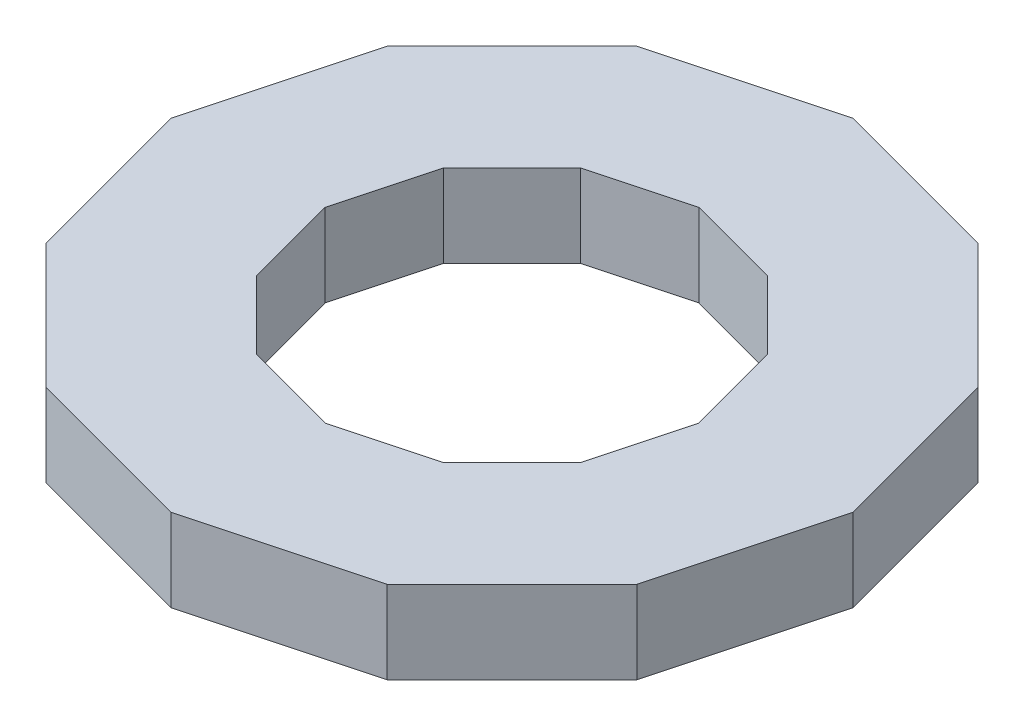
ISO-10303-21;
HEADER;
FILE_DESCRIPTION(('STEP AP214'),'2;1');
FILE_NAME('part.step','',(''),(''),'','','');
FILE_SCHEMA(('AUTOMOTIVE_DESIGN { 1 0 10303 214 1 1 1 1 }'));
ENDSEC;
DATA;
#1=APPLICATION_CONTEXT('core data for automotive mechanical design processes');
#2=APPLICATION_PROTOCOL_DEFINITION('international standard','automotive_design',2000,#1);
#3=PRODUCT_CONTEXT('',#1,'mechanical');
#4=PRODUCT('Part','Part','',(#3));
#5=PRODUCT_RELATED_PRODUCT_CATEGORY('part','',(#4));
#6=PRODUCT_DEFINITION_FORMATION('','',#4);
#7=PRODUCT_DEFINITION_CONTEXT('part definition',#1,'design');
#8=PRODUCT_DEFINITION('design','',#6,#7);
#9=PRODUCT_DEFINITION_SHAPE('','',#8);
#10=(LENGTH_UNIT() NAMED_UNIT(*) SI_UNIT(.MILLI.,.METRE.));
#11=(NAMED_UNIT(*) PLANE_ANGLE_UNIT() SI_UNIT($,.RADIAN.));
#12=(NAMED_UNIT(*) SI_UNIT($,.STERADIAN.) SOLID_ANGLE_UNIT());
#13=UNCERTAINTY_MEASURE_WITH_UNIT(LENGTH_MEASURE(1.E-05),#10,'distance_accuracy_value','');
#14=(GEOMETRIC_REPRESENTATION_CONTEXT(3) GLOBAL_UNCERTAINTY_ASSIGNED_CONTEXT((#13)) GLOBAL_UNIT_ASSIGNED_CONTEXT((#10,
#11,#12)) REPRESENTATION_CONTEXT('',''));
#15=CARTESIAN_POINT('',(0.,0.,0.));
#16=DIRECTION('',(0.,0.,1.));
#17=DIRECTION('',(1.,0.,0.));
#18=AXIS2_PLACEMENT_3D('',#15,#16,#17);
#19=CARTESIAN_POINT('',(0.,19.05,0.));
#20=DIRECTION('',(0.,1.,0.));
#21=DIRECTION('',(0.,0.,1.));
#22=AXIS2_PLACEMENT_3D('',#19,#20,#21);
#23=PLANE('',#22);
#24=DIRECTION('',(0.258819045102521,0.,-0.965925826289068));
#25=VECTOR('',#24,1.);
#26=CARTESIAN_POINT('',(67.9920451678091,19.05,39.2552255803878));
#27=LINE('',#26,#25);
#28=CARTESIAN_POINT('',(67.9920451678091,19.05,39.2552255803878));
#29=VERTEX_POINT('',#28);
#30=CARTESIAN_POINT('',(78.5104511607755,19.05,0.));
#31=VERTEX_POINT('',#30);
#32=EDGE_CURVE('E299',#29,#31,#27,.T.);
#33=ORIENTED_EDGE('',*,*,#32,.T.);
#34=DIRECTION('',(-0.25881904510252,0.,-0.965925826289069));
#35=VECTOR('',#34,1.);
#36=CARTESIAN_POINT('',(78.5104511607755,19.05,0.));
#37=LINE('',#36,#35);
#38=CARTESIAN_POINT('',(67.9920451678091,19.05,-39.2552255803878));
#39=VERTEX_POINT('',#38);
#40=EDGE_CURVE('E303',#31,#39,#37,.T.);
#41=ORIENTED_EDGE('',*,*,#40,.T.);
#42=DIRECTION('',(-0.707106781186548,0.,-0.707106781186547));
#43=VECTOR('',#42,1.);
#44=CARTESIAN_POINT('',(67.9920451678091,19.05,-39.2552255803878));
#45=LINE('',#44,#43);
#46=CARTESIAN_POINT('',(39.2552255803878,19.05,-67.9920451678091));
#47=VERTEX_POINT('',#46);
#48=EDGE_CURVE('E307',#39,#47,#45,.T.);
#49=ORIENTED_EDGE('',*,*,#48,.T.);
#50=DIRECTION('',(-0.965925826289068,0.,-0.258819045102521));
#51=VECTOR('',#50,1.);
#52=CARTESIAN_POINT('',(39.2552255803878,19.05,-67.9920451678091));
#53=LINE('',#52,#51);
#54=CARTESIAN_POINT('',(0.,19.05,-78.5104511607755));
#55=VERTEX_POINT('',#54);
#56=EDGE_CURVE('E309',#47,#55,#53,.T.);
#57=ORIENTED_EDGE('',*,*,#56,.T.);
#58=DIRECTION('',(-0.965925826289068,0.,0.258819045102521));
#59=VECTOR('',#58,1.);
#60=CARTESIAN_POINT('',(0.,19.05,-78.5104511607755));
#61=LINE('',#60,#59);
#62=CARTESIAN_POINT('',(-39.2552255803877,19.05,-67.9920451678091));
#63=VERTEX_POINT('',#62);
#64=EDGE_CURVE('E312',#55,#63,#61,.T.);
#65=ORIENTED_EDGE('',*,*,#64,.T.);
#66=DIRECTION('',(-0.707106781186548,0.,0.707106781186548));
#67=VECTOR('',#66,1.);
#68=CARTESIAN_POINT('',(-39.2552255803877,19.05,-67.9920451678091));
#69=LINE('',#68,#67);
#70=CARTESIAN_POINT('',(-67.9920451678091,19.05,-39.2552255803877));
#71=VERTEX_POINT('',#70);
#72=EDGE_CURVE('E315',#63,#71,#69,.T.);
#73=ORIENTED_EDGE('',*,*,#72,.T.);
#74=DIRECTION('',(-0.258819045102521,0.,0.965925826289068));
#75=VECTOR('',#74,1.);
#76=CARTESIAN_POINT('',(-67.9920451678091,19.05,-39.2552255803877));
#77=LINE('',#76,#75);
#78=CARTESIAN_POINT('',(-78.5104511607755,19.05,0.));
#79=VERTEX_POINT('',#78);
#80=EDGE_CURVE('E317',#71,#79,#77,.T.);
#81=ORIENTED_EDGE('',*,*,#80,.T.);
#82=DIRECTION('',(0.25881904510252,0.,0.965925826289068));
#83=VECTOR('',#82,1.);
#84=CARTESIAN_POINT('',(-78.5104511607755,19.05,0.));
#85=LINE('',#84,#83);
#86=CARTESIAN_POINT('',(-67.9920451678091,19.05,39.2552255803878));
#87=VERTEX_POINT('',#86);
#88=EDGE_CURVE('E320',#79,#87,#85,.T.);
#89=ORIENTED_EDGE('',*,*,#88,.T.);
#90=DIRECTION('',(0.707106781186548,0.,0.707106781186547));
#91=VECTOR('',#90,1.);
#92=CARTESIAN_POINT('',(-67.9920451678091,19.05,39.2552255803878));
#93=LINE('',#92,#91);
#94=CARTESIAN_POINT('',(-39.2552255803878,19.05,67.9920451678091));
#95=VERTEX_POINT('',#94);
#96=EDGE_CURVE('E322',#87,#95,#93,.T.);
#97=ORIENTED_EDGE('',*,*,#96,.T.);
#98=DIRECTION('',(0.965925826289068,0.,0.258819045102521));
#99=VECTOR('',#98,1.);
#100=CARTESIAN_POINT('',(-39.2552255803878,19.05,67.9920451678091));
#101=LINE('',#100,#99);
#102=CARTESIAN_POINT('',(0.,19.05,78.5104511607755));
#103=VERTEX_POINT('',#102);
#104=EDGE_CURVE('E324',#95,#103,#101,.T.);
#105=ORIENTED_EDGE('',*,*,#104,.T.);
#106=DIRECTION('',(0.965925826289068,0.,-0.25881904510252));
#107=VECTOR('',#106,1.);
#108=CARTESIAN_POINT('',(0.,19.05,78.5104511607755));
#109=LINE('',#108,#107);
#110=CARTESIAN_POINT('',(39.2552255803877,19.05,67.9920451678091));
#111=VERTEX_POINT('',#110);
#112=EDGE_CURVE('E326',#103,#111,#109,.T.);
#113=ORIENTED_EDGE('',*,*,#112,.T.);
#114=DIRECTION('',(0.707106781186547,0.,-0.707106781186548));
#115=VECTOR('',#114,1.);
#116=CARTESIAN_POINT('',(39.2552255803877,19.05,67.9920451678091));
#117=LINE('',#116,#115);
#118=EDGE_CURVE('E328',#111,#29,#117,.T.);
#119=ORIENTED_EDGE('',*,*,#118,.T.);
#120=EDGE_LOOP('',(#33,#41,#49,#57,#65,#73,#81,#89,#97,#105,#113,#119));
#121=FACE_BOUND('',#120,.T.);
#122=DIRECTION('',(-0.258819045102521,0.,-0.965925826289068));
#123=VECTOR('',#122,1.);
#124=CARTESIAN_POINT('',(43.0108309345138,19.05,0.));
#125=LINE('',#124,#123);
#126=CARTESIAN_POINT('',(43.0108309345138,19.05,0.));
#127=VERTEX_POINT('',#126);
#128=CARTESIAN_POINT('',(37.2484722271665,19.05,-21.5054154672569));
#129=VERTEX_POINT('',#128);
#130=EDGE_CURVE('E206',#127,#129,#125,.T.);
#131=ORIENTED_EDGE('',*,*,#130,.F.);
#132=DIRECTION('',(0.258819045102521,0.,-0.965925826289068));
#133=VECTOR('',#132,1.);
#134=CARTESIAN_POINT('',(37.2484722271665,19.05,21.5054154672569));
#135=LINE('',#134,#133);
#136=CARTESIAN_POINT('',(37.2484722271665,19.05,21.5054154672569));
#137=VERTEX_POINT('',#136);
#138=EDGE_CURVE('E197',#137,#127,#135,.T.);
#139=ORIENTED_EDGE('',*,*,#138,.F.);
#140=DIRECTION('',(0.707106781186547,0.,-0.707106781186547));
#141=VECTOR('',#140,1.);
#142=CARTESIAN_POINT('',(21.5054154672569,19.05,37.2484722271665));
#143=LINE('',#142,#141);
#144=CARTESIAN_POINT('',(21.5054154672569,19.05,37.2484722271665));
#145=VERTEX_POINT('',#144);
#146=EDGE_CURVE('E244',#145,#137,#143,.T.);
#147=ORIENTED_EDGE('',*,*,#146,.F.);
#148=DIRECTION('',(0.965925826289068,0.,-0.258819045102521));
#149=VECTOR('',#148,1.);
#150=CARTESIAN_POINT('',(0.,19.05,43.0108309345138));
#151=LINE('',#150,#149);
#152=CARTESIAN_POINT('',(0.,19.05,43.0108309345138));
#153=VERTEX_POINT('',#152);
#154=EDGE_CURVE('E242',#153,#145,#151,.T.);
#155=ORIENTED_EDGE('',*,*,#154,.F.);
#156=DIRECTION('',(0.965925826289068,0.,0.258819045102521));
#157=VECTOR('',#156,1.);
#158=CARTESIAN_POINT('',(-21.5054154672569,19.05,37.2484722271665));
#159=LINE('',#158,#157);
#160=CARTESIAN_POINT('',(-21.5054154672569,19.05,37.2484722271665));
#161=VERTEX_POINT('',#160);
#162=EDGE_CURVE('E240',#161,#153,#159,.T.);
#163=ORIENTED_EDGE('',*,*,#162,.F.);
#164=DIRECTION('',(0.707106781186547,0.,0.707106781186547));
#165=VECTOR('',#164,1.);
#166=CARTESIAN_POINT('',(-37.2484722271665,19.05,21.5054154672569));
#167=LINE('',#166,#165);
#168=CARTESIAN_POINT('',(-37.2484722271665,19.05,21.5054154672569));
#169=VERTEX_POINT('',#168);
#170=EDGE_CURVE('E238',#169,#161,#167,.T.);
#171=ORIENTED_EDGE('',*,*,#170,.F.);
#172=DIRECTION('',(0.258819045102521,0.,0.965925826289068));
#173=VECTOR('',#172,1.);
#174=CARTESIAN_POINT('',(-43.0108309345138,19.05,0.));
#175=LINE('',#174,#173);
#176=CARTESIAN_POINT('',(-43.0108309345138,19.05,0.));
#177=VERTEX_POINT('',#176);
#178=EDGE_CURVE('E236',#177,#169,#175,.T.);
#179=ORIENTED_EDGE('',*,*,#178,.F.);
#180=DIRECTION('',(-0.258819045102521,0.,0.965925826289068));
#181=VECTOR('',#180,1.);
#182=CARTESIAN_POINT('',(-37.2484722271665,19.05,-21.5054154672569));
#183=LINE('',#182,#181);
#184=CARTESIAN_POINT('',(-37.2484722271665,19.05,-21.5054154672569));
#185=VERTEX_POINT('',#184);
#186=EDGE_CURVE('E234',#185,#177,#183,.T.);
#187=ORIENTED_EDGE('',*,*,#186,.F.);
#188=DIRECTION('',(-0.707106781186548,0.,0.707106781186548));
#189=VECTOR('',#188,1.);
#190=CARTESIAN_POINT('',(-21.5054154672569,19.05,-37.2484722271665));
#191=LINE('',#190,#189);
#192=CARTESIAN_POINT('',(-21.5054154672569,19.05,-37.2484722271665));
#193=VERTEX_POINT('',#192);
#194=EDGE_CURVE('E232',#193,#185,#191,.T.);
#195=ORIENTED_EDGE('',*,*,#194,.F.);
#196=DIRECTION('',(-0.965925826289068,0.,0.258819045102521));
#197=VECTOR('',#196,1.);
#198=CARTESIAN_POINT('',(0.,19.05,-43.0108309345138));
#199=LINE('',#198,#197);
#200=CARTESIAN_POINT('',(0.,19.05,-43.0108309345138));
#201=VERTEX_POINT('',#200);
#202=EDGE_CURVE('E229',#201,#193,#199,.T.);
#203=ORIENTED_EDGE('',*,*,#202,.F.);
#204=DIRECTION('',(-0.965925826289068,0.,-0.258819045102521));
#205=VECTOR('',#204,1.);
#206=CARTESIAN_POINT('',(21.5054154672568,19.05,-37.2484722271665));
#207=LINE('',#206,#205);
#208=CARTESIAN_POINT('',(21.5054154672568,19.05,-37.2484722271665));
#209=VERTEX_POINT('',#208);
#210=EDGE_CURVE('E225',#209,#201,#207,.T.);
#211=ORIENTED_EDGE('',*,*,#210,.F.);
#212=DIRECTION('',(-0.707106781186548,0.,-0.707106781186547));
#213=VECTOR('',#212,1.);
#214=CARTESIAN_POINT('',(37.2484722271665,19.05,-21.5054154672569));
#215=LINE('',#214,#213);
#216=EDGE_CURVE('E219',#129,#209,#215,.T.);
#217=ORIENTED_EDGE('',*,*,#216,.F.);
#218=EDGE_LOOP('',(#131,#139,#147,#155,#163,#171,#179,#187,#195,#203,#211,#217));
#219=FACE_BOUND('',#218,.T.);
#220=ADVANCED_FACE('F35',(#121,#219),#23,.T.);
#221=CARTESIAN_POINT('',(0.,0.,0.));
#222=DIRECTION('',(0.,1.,0.));
#223=DIRECTION('',(0.,0.,1.));
#224=AXIS2_PLACEMENT_3D('',#221,#222,#223);
#225=PLANE('',#224);
#226=DIRECTION('',(0.258819045102521,0.,-0.965925826289068));
#227=VECTOR('',#226,1.);
#228=CARTESIAN_POINT('',(67.9920451678091,0.,39.2552255803878));
#229=LINE('',#228,#227);
#230=CARTESIAN_POINT('',(67.9920451678091,0.,39.2552255803878));
#231=VERTEX_POINT('',#230);
#232=CARTESIAN_POINT('',(78.5104511607755,0.,0.));
#233=VERTEX_POINT('',#232);
#234=EDGE_CURVE('E214',#231,#233,#229,.T.);
#235=ORIENTED_EDGE('',*,*,#234,.F.);
#236=DIRECTION('',(0.707106781186547,0.,-0.707106781186548));
#237=VECTOR('',#236,1.);
#238=CARTESIAN_POINT('',(39.2552255803877,0.,67.9920451678091));
#239=LINE('',#238,#237);
#240=CARTESIAN_POINT('',(39.2552255803877,0.,67.9920451678091));
#241=VERTEX_POINT('',#240);
#242=EDGE_CURVE('E304',#241,#231,#239,.T.);
#243=ORIENTED_EDGE('',*,*,#242,.F.);
#244=DIRECTION('',(0.965925826289068,0.,-0.25881904510252));
#245=VECTOR('',#244,1.);
#246=CARTESIAN_POINT('',(0.,0.,78.5104511607755));
#247=LINE('',#246,#245);
#248=CARTESIAN_POINT('',(0.,0.,78.5104511607755));
#249=VERTEX_POINT('',#248);
#250=EDGE_CURVE('E354',#249,#241,#247,.T.);
#251=ORIENTED_EDGE('',*,*,#250,.F.);
#252=DIRECTION('',(0.965925826289068,0.,0.258819045102521));
#253=VECTOR('',#252,1.);
#254=CARTESIAN_POINT('',(-39.2552255803878,0.,67.9920451678091));
#255=LINE('',#254,#253);
#256=CARTESIAN_POINT('',(-39.2552255803878,0.,67.9920451678091));
#257=VERTEX_POINT('',#256);
#258=EDGE_CURVE('E352',#257,#249,#255,.T.);
#259=ORIENTED_EDGE('',*,*,#258,.F.);
#260=DIRECTION('',(0.707106781186548,0.,0.707106781186547));
#261=VECTOR('',#260,1.);
#262=CARTESIAN_POINT('',(-67.9920451678091,0.,39.2552255803878));
#263=LINE('',#262,#261);
#264=CARTESIAN_POINT('',(-67.9920451678091,0.,39.2552255803878));
#265=VERTEX_POINT('',#264);
#266=EDGE_CURVE('E350',#265,#257,#263,.T.);
#267=ORIENTED_EDGE('',*,*,#266,.F.);
#268=DIRECTION('',(0.25881904510252,0.,0.965925826289068));
#269=VECTOR('',#268,1.);
#270=CARTESIAN_POINT('',(-78.5104511607755,0.,0.));
#271=LINE('',#270,#269);
#272=CARTESIAN_POINT('',(-78.5104511607755,0.,0.));
#273=VERTEX_POINT('',#272);
#274=EDGE_CURVE('E348',#273,#265,#271,.T.);
#275=ORIENTED_EDGE('',*,*,#274,.F.);
#276=DIRECTION('',(-0.258819045102521,0.,0.965925826289068));
#277=VECTOR('',#276,1.);
#278=CARTESIAN_POINT('',(-67.9920451678091,0.,-39.2552255803877));
#279=LINE('',#278,#277);
#280=CARTESIAN_POINT('',(-67.9920451678091,0.,-39.2552255803877));
#281=VERTEX_POINT('',#280);
#282=EDGE_CURVE('E345',#281,#273,#279,.T.);
#283=ORIENTED_EDGE('',*,*,#282,.F.);
#284=DIRECTION('',(-0.707106781186548,0.,0.707106781186548));
#285=VECTOR('',#284,1.);
#286=CARTESIAN_POINT('',(-39.2552255803877,0.,-67.9920451678091));
#287=LINE('',#286,#285);
#288=CARTESIAN_POINT('',(-39.2552255803877,0.,-67.9920451678091));
#289=VERTEX_POINT('',#288);
#290=EDGE_CURVE('E343',#289,#281,#287,.T.);
#291=ORIENTED_EDGE('',*,*,#290,.F.);
#292=DIRECTION('',(-0.965925826289068,0.,0.258819045102521));
#293=VECTOR('',#292,1.);
#294=CARTESIAN_POINT('',(0.,0.,-78.5104511607755));
#295=LINE('',#294,#293);
#296=CARTESIAN_POINT('',(0.,0.,-78.5104511607755));
#297=VERTEX_POINT('',#296);
#298=EDGE_CURVE('E341',#297,#289,#295,.T.);
#299=ORIENTED_EDGE('',*,*,#298,.F.);
#300=DIRECTION('',(-0.965925826289068,0.,-0.258819045102521));
#301=VECTOR('',#300,1.);
#302=CARTESIAN_POINT('',(39.2552255803878,0.,-67.9920451678091));
#303=LINE('',#302,#301);
#304=CARTESIAN_POINT('',(39.2552255803878,0.,-67.9920451678091));
#305=VERTEX_POINT('',#304);
#306=EDGE_CURVE('E339',#305,#297,#303,.T.);
#307=ORIENTED_EDGE('',*,*,#306,.F.);
#308=DIRECTION('',(-0.707106781186548,0.,-0.707106781186547));
#309=VECTOR('',#308,1.);
#310=CARTESIAN_POINT('',(67.9920451678091,0.,-39.2552255803878));
#311=LINE('',#310,#309);
#312=CARTESIAN_POINT('',(67.9920451678091,0.,-39.2552255803878));
#313=VERTEX_POINT('',#312);
#314=EDGE_CURVE('E336',#313,#305,#311,.T.);
#315=ORIENTED_EDGE('',*,*,#314,.F.);
#316=DIRECTION('',(-0.25881904510252,0.,-0.965925826289069));
#317=VECTOR('',#316,1.);
#318=CARTESIAN_POINT('',(78.5104511607755,0.,0.));
#319=LINE('',#318,#317);
#320=EDGE_CURVE('E333',#233,#313,#319,.T.);
#321=ORIENTED_EDGE('',*,*,#320,.F.);
#322=EDGE_LOOP('',(#235,#243,#251,#259,#267,#275,#283,#291,#299,#307,#315,#321));
#323=FACE_BOUND('',#322,.T.);
#324=DIRECTION('',(0.258819045102521,0.,-0.965925826289068));
#325=VECTOR('',#324,1.);
#326=CARTESIAN_POINT('',(37.2484722271665,0.,21.5054154672569));
#327=LINE('',#326,#325);
#328=CARTESIAN_POINT('',(37.2484722271665,0.,21.5054154672569));
#329=VERTEX_POINT('',#328);
#330=CARTESIAN_POINT('',(43.0108309345138,0.,0.));
#331=VERTEX_POINT('',#330);
#332=EDGE_CURVE('E59',#329,#331,#327,.T.);
#333=ORIENTED_EDGE('',*,*,#332,.T.);
#334=DIRECTION('',(-0.258819045102521,0.,-0.965925826289068));
#335=VECTOR('',#334,1.);
#336=CARTESIAN_POINT('',(43.0108309345138,0.,0.));
#337=LINE('',#336,#335);
#338=CARTESIAN_POINT('',(37.2484722271665,0.,-21.5054154672569));
#339=VERTEX_POINT('',#338);
#340=EDGE_CURVE('E213',#331,#339,#337,.T.);
#341=ORIENTED_EDGE('',*,*,#340,.T.);
#342=DIRECTION('',(-0.707106781186548,0.,-0.707106781186547));
#343=VECTOR('',#342,1.);
#344=CARTESIAN_POINT('',(37.2484722271665,0.,-21.5054154672569));
#345=LINE('',#344,#343);
#346=CARTESIAN_POINT('',(21.5054154672568,0.,-37.2484722271665));
#347=VERTEX_POINT('',#346);
#348=EDGE_CURVE('E249',#339,#347,#345,.T.);
#349=ORIENTED_EDGE('',*,*,#348,.T.);
#350=DIRECTION('',(-0.965925826289068,0.,-0.258819045102521));
#351=VECTOR('',#350,1.);
#352=CARTESIAN_POINT('',(21.5054154672568,0.,-37.2484722271665));
#353=LINE('',#352,#351);
#354=CARTESIAN_POINT('',(0.,0.,-43.0108309345138));
#355=VERTEX_POINT('',#354);
#356=EDGE_CURVE('E252',#347,#355,#353,.T.);
#357=ORIENTED_EDGE('',*,*,#356,.T.);
#358=DIRECTION('',(-0.965925826289068,0.,0.258819045102521));
#359=VECTOR('',#358,1.);
#360=CARTESIAN_POINT('',(0.,0.,-43.0108309345138));
#361=LINE('',#360,#359);
#362=CARTESIAN_POINT('',(-21.5054154672569,0.,-37.2484722271665));
#363=VERTEX_POINT('',#362);
#364=EDGE_CURVE('E256',#355,#363,#361,.T.);
#365=ORIENTED_EDGE('',*,*,#364,.T.);
#366=DIRECTION('',(-0.707106781186548,0.,0.707106781186548));
#367=VECTOR('',#366,1.);
#368=CARTESIAN_POINT('',(-21.5054154672569,0.,-37.2484722271665));
#369=LINE('',#368,#367);
#370=CARTESIAN_POINT('',(-37.2484722271665,0.,-21.5054154672569));
#371=VERTEX_POINT('',#370);
#372=EDGE_CURVE('E259',#363,#371,#369,.T.);
#373=ORIENTED_EDGE('',*,*,#372,.T.);
#374=DIRECTION('',(-0.258819045102521,0.,0.965925826289068));
#375=VECTOR('',#374,1.);
#376=CARTESIAN_POINT('',(-37.2484722271665,0.,-21.5054154672569));
#377=LINE('',#376,#375);
#378=CARTESIAN_POINT('',(-43.0108309345138,0.,0.));
#379=VERTEX_POINT('',#378);
#380=EDGE_CURVE('E262',#371,#379,#377,.T.);
#381=ORIENTED_EDGE('',*,*,#380,.T.);
#382=DIRECTION('',(0.258819045102521,0.,0.965925826289068));
#383=VECTOR('',#382,1.);
#384=CARTESIAN_POINT('',(-43.0108309345138,0.,0.));
#385=LINE('',#384,#383);
#386=CARTESIAN_POINT('',(-37.2484722271665,0.,21.5054154672569));
#387=VERTEX_POINT('',#386);
#388=EDGE_CURVE('E265',#379,#387,#385,.T.);
#389=ORIENTED_EDGE('',*,*,#388,.T.);
#390=DIRECTION('',(0.707106781186547,0.,0.707106781186547));
#391=VECTOR('',#390,1.);
#392=CARTESIAN_POINT('',(-37.2484722271665,0.,21.5054154672569));
#393=LINE('',#392,#391);
#394=CARTESIAN_POINT('',(-21.5054154672569,0.,37.2484722271665));
#395=VERTEX_POINT('',#394);
#396=EDGE_CURVE('E268',#387,#395,#393,.T.);
#397=ORIENTED_EDGE('',*,*,#396,.T.);
#398=DIRECTION('',(0.965925826289068,0.,0.258819045102521));
#399=VECTOR('',#398,1.);
#400=CARTESIAN_POINT('',(-21.5054154672569,0.,37.2484722271665));
#401=LINE('',#400,#399);
#402=CARTESIAN_POINT('',(0.,0.,43.0108309345138));
#403=VERTEX_POINT('',#402);
#404=EDGE_CURVE('E271',#395,#403,#401,.T.);
#405=ORIENTED_EDGE('',*,*,#404,.T.);
#406=DIRECTION('',(0.965925826289068,0.,-0.258819045102521));
#407=VECTOR('',#406,1.);
#408=CARTESIAN_POINT('',(0.,0.,43.0108309345138));
#409=LINE('',#408,#407);
#410=CARTESIAN_POINT('',(21.5054154672569,0.,37.2484722271665));
#411=VERTEX_POINT('',#410);
#412=EDGE_CURVE('E274',#403,#411,#409,.T.);
#413=ORIENTED_EDGE('',*,*,#412,.T.);
#414=DIRECTION('',(0.707106781186547,0.,-0.707106781186547));
#415=VECTOR('',#414,1.);
#416=CARTESIAN_POINT('',(21.5054154672569,0.,37.2484722271665));
#417=LINE('',#416,#415);
#418=EDGE_CURVE('E207',#411,#329,#417,.T.);
#419=ORIENTED_EDGE('',*,*,#418,.T.);
#420=EDGE_LOOP('',(#333,#341,#349,#357,#365,#373,#381,#389,#397,#405,#413,#419));
#421=FACE_BOUND('',#420,.T.);
#422=ADVANCED_FACE('F397',(#323,#421),#225,.F.);
#423=CARTESIAN_POINT('',(67.9920451678091,19.05,39.2552255803878));
#424=DIRECTION('',(-0.965925826289068,0.,-0.258819045102521));
#425=DIRECTION('',(-0.258819045102521,0.,0.965925826289068));
#426=AXIS2_PLACEMENT_3D('',#423,#424,#425);
#427=PLANE('',#426);
#428=ORIENTED_EDGE('',*,*,#234,.T.);
#429=DIRECTION('',(0.,-1.,0.));
#430=VECTOR('',#429,1.);
#431=CARTESIAN_POINT('',(78.5104511607755,19.05,0.));
#432=LINE('',#431,#430);
#433=EDGE_CURVE('E11',#31,#233,#432,.T.);
#434=ORIENTED_EDGE('',*,*,#433,.F.);
#435=ORIENTED_EDGE('',*,*,#32,.F.);
#436=DIRECTION('',(0.,-1.,0.));
#437=VECTOR('',#436,1.);
#438=CARTESIAN_POINT('',(67.9920451678091,19.05,39.2552255803878));
#439=LINE('',#438,#437);
#440=EDGE_CURVE('E330',#29,#231,#439,.T.);
#441=ORIENTED_EDGE('',*,*,#440,.T.);
#442=EDGE_LOOP('',(#428,#434,#435,#441));
#443=FACE_BOUND('',#442,.T.);
#444=ADVANCED_FACE('F37',(#443),#427,.F.);
#445=CARTESIAN_POINT('',(78.5104511607755,19.05,0.));
#446=DIRECTION('',(-0.965925826289068,0.,0.25881904510252));
#447=DIRECTION('',(0.25881904510252,0.,0.965925826289069));
#448=AXIS2_PLACEMENT_3D('',#445,#446,#447);
#449=PLANE('',#448);
#450=ORIENTED_EDGE('',*,*,#320,.T.);
#451=DIRECTION('',(0.,-1.,0.));
#452=VECTOR('',#451,1.);
#453=CARTESIAN_POINT('',(67.9920451678091,19.05,-39.2552255803878));
#454=LINE('',#453,#452);
#455=EDGE_CURVE('E44',#39,#313,#454,.T.);
#456=ORIENTED_EDGE('',*,*,#455,.F.);
#457=ORIENTED_EDGE('',*,*,#40,.F.);
#458=ORIENTED_EDGE('',*,*,#433,.T.);
#459=EDGE_LOOP('',(#450,#456,#457,#458));
#460=FACE_BOUND('',#459,.T.);
#461=ADVANCED_FACE('F414',(#460),#449,.F.);
#462=CARTESIAN_POINT('',(67.9920451678091,19.05,-39.2552255803878));
#463=DIRECTION('',(-0.707106781186547,0.,0.707106781186548));
#464=DIRECTION('',(0.707106781186548,0.,0.707106781186547));
#465=AXIS2_PLACEMENT_3D('',#462,#463,#464);
#466=PLANE('',#465);
#467=ORIENTED_EDGE('',*,*,#314,.T.);
#468=DIRECTION('',(0.,-1.,0.));
#469=VECTOR('',#468,1.);
#470=CARTESIAN_POINT('',(39.2552255803878,19.05,-67.9920451678091));
#471=LINE('',#470,#469);
#472=EDGE_CURVE('E384',#47,#305,#471,.T.);
#473=ORIENTED_EDGE('',*,*,#472,.F.);
#474=ORIENTED_EDGE('',*,*,#48,.F.);
#475=ORIENTED_EDGE('',*,*,#455,.T.);
#476=EDGE_LOOP('',(#467,#473,#474,#475));
#477=FACE_BOUND('',#476,.T.);
#478=ADVANCED_FACE('F391',(#477),#466,.F.);
#479=CARTESIAN_POINT('',(39.2552255803878,19.05,-67.9920451678091));
#480=DIRECTION('',(-0.258819045102521,0.,0.965925826289068));
#481=DIRECTION('',(0.965925826289068,0.,0.258819045102521));
#482=AXIS2_PLACEMENT_3D('',#479,#480,#481);
#483=PLANE('',#482);
#484=ORIENTED_EDGE('',*,*,#306,.T.);
#485=DIRECTION('',(0.,-1.,0.));
#486=VECTOR('',#485,1.);
#487=CARTESIAN_POINT('',(0.,19.05,-78.5104511607755));
#488=LINE('',#487,#486);
#489=EDGE_CURVE('E381',#55,#297,#488,.T.);
#490=ORIENTED_EDGE('',*,*,#489,.F.);
#491=ORIENTED_EDGE('',*,*,#56,.F.);
#492=ORIENTED_EDGE('',*,*,#472,.T.);
#493=EDGE_LOOP('',(#484,#490,#491,#492));
#494=FACE_BOUND('',#493,.T.);
#495=ADVANCED_FACE('F403',(#494),#483,.F.);
#496=CARTESIAN_POINT('',(0.,19.05,-78.5104511607755));
#497=DIRECTION('',(0.258819045102521,0.,0.965925826289068));
#498=DIRECTION('',(0.965925826289068,0.,-0.258819045102521));
#499=AXIS2_PLACEMENT_3D('',#496,#497,#498);
#500=PLANE('',#499);
#501=ORIENTED_EDGE('',*,*,#298,.T.);
#502=DIRECTION('',(0.,-1.,0.));
#503=VECTOR('',#502,1.);
#504=CARTESIAN_POINT('',(-39.2552255803877,19.05,-67.9920451678091));
#505=LINE('',#504,#503);
#506=EDGE_CURVE('E378',#63,#289,#505,.T.);
#507=ORIENTED_EDGE('',*,*,#506,.F.);
#508=ORIENTED_EDGE('',*,*,#64,.F.);
#509=ORIENTED_EDGE('',*,*,#489,.T.);
#510=EDGE_LOOP('',(#501,#507,#508,#509));
#511=FACE_BOUND('',#510,.T.);
#512=ADVANCED_FACE('F407',(#511),#500,.F.);
#513=CARTESIAN_POINT('',(-39.2552255803877,19.05,-67.9920451678091));
#514=DIRECTION('',(0.707106781186548,0.,0.707106781186548));
#515=DIRECTION('',(0.707106781186548,0.,-0.707106781186548));
#516=AXIS2_PLACEMENT_3D('',#513,#514,#515);
#517=PLANE('',#516);
#518=ORIENTED_EDGE('',*,*,#290,.T.);
#519=DIRECTION('',(0.,-1.,0.));
#520=VECTOR('',#519,1.);
#521=CARTESIAN_POINT('',(-67.9920451678091,19.05,-39.2552255803877));
#522=LINE('',#521,#520);
#523=EDGE_CURVE('E375',#71,#281,#522,.T.);
#524=ORIENTED_EDGE('',*,*,#523,.F.);
#525=ORIENTED_EDGE('',*,*,#72,.F.);
#526=ORIENTED_EDGE('',*,*,#506,.T.);
#527=EDGE_LOOP('',(#518,#524,#525,#526));
#528=FACE_BOUND('',#527,.T.);
#529=ADVANCED_FACE('F447',(#528),#517,.F.);
#530=CARTESIAN_POINT('',(-67.9920451678091,19.05,-39.2552255803877));
#531=DIRECTION('',(0.965925826289068,0.,0.258819045102521));
#532=DIRECTION('',(0.258819045102521,0.,-0.965925826289068));
#533=AXIS2_PLACEMENT_3D('',#530,#531,#532);
#534=PLANE('',#533);
#535=ORIENTED_EDGE('',*,*,#282,.T.);
#536=DIRECTION('',(0.,-1.,0.));
#537=VECTOR('',#536,1.);
#538=CARTESIAN_POINT('',(-78.5104511607755,19.05,0.));
#539=LINE('',#538,#537);
#540=EDGE_CURVE('E372',#79,#273,#539,.T.);
#541=ORIENTED_EDGE('',*,*,#540,.F.);
#542=ORIENTED_EDGE('',*,*,#80,.F.);
#543=ORIENTED_EDGE('',*,*,#523,.T.);
#544=EDGE_LOOP('',(#535,#541,#542,#543));
#545=FACE_BOUND('',#544,.T.);
#546=ADVANCED_FACE('F445',(#545),#534,.F.);
#547=CARTESIAN_POINT('',(-78.5104511607755,19.05,0.));
#548=DIRECTION('',(0.965925826289068,0.,-0.25881904510252));
#549=DIRECTION('',(-0.25881904510252,0.,-0.965925826289069));
#550=AXIS2_PLACEMENT_3D('',#547,#548,#549);
#551=PLANE('',#550);
#552=ORIENTED_EDGE('',*,*,#274,.T.);
#553=DIRECTION('',(0.,-1.,0.));
#554=VECTOR('',#553,1.);
#555=CARTESIAN_POINT('',(-67.9920451678091,19.05,39.2552255803878));
#556=LINE('',#555,#554);
#557=EDGE_CURVE('E369',#87,#265,#556,.T.);
#558=ORIENTED_EDGE('',*,*,#557,.F.);
#559=ORIENTED_EDGE('',*,*,#88,.F.);
#560=ORIENTED_EDGE('',*,*,#540,.T.);
#561=EDGE_LOOP('',(#552,#558,#559,#560));
#562=FACE_BOUND('',#561,.T.);
#563=ADVANCED_FACE('F441',(#562),#551,.F.);
#564=CARTESIAN_POINT('',(-67.9920451678091,19.05,39.2552255803878));
#565=DIRECTION('',(0.707106781186547,0.,-0.707106781186548));
#566=DIRECTION('',(-0.707106781186548,0.,-0.707106781186547));
#567=AXIS2_PLACEMENT_3D('',#564,#565,#566);
#568=PLANE('',#567);
#569=ORIENTED_EDGE('',*,*,#266,.T.);
#570=DIRECTION('',(0.,-1.,0.));
#571=VECTOR('',#570,1.);
#572=CARTESIAN_POINT('',(-39.2552255803878,19.05,67.9920451678091));
#573=LINE('',#572,#571);
#574=EDGE_CURVE('E366',#95,#257,#573,.T.);
#575=ORIENTED_EDGE('',*,*,#574,.F.);
#576=ORIENTED_EDGE('',*,*,#96,.F.);
#577=ORIENTED_EDGE('',*,*,#557,.T.);
#578=EDGE_LOOP('',(#569,#575,#576,#577));
#579=FACE_BOUND('',#578,.T.);
#580=ADVANCED_FACE('F436',(#579),#568,.F.);
#581=CARTESIAN_POINT('',(-39.2552255803878,19.05,67.9920451678091));
#582=DIRECTION('',(0.258819045102521,0.,-0.965925826289068));
#583=DIRECTION('',(-0.965925826289068,0.,-0.258819045102521));
#584=AXIS2_PLACEMENT_3D('',#581,#582,#583);
#585=PLANE('',#584);
#586=ORIENTED_EDGE('',*,*,#258,.T.);
#587=DIRECTION('',(0.,-1.,0.));
#588=VECTOR('',#587,1.);
#589=CARTESIAN_POINT('',(0.,19.05,78.5104511607755));
#590=LINE('',#589,#588);
#591=EDGE_CURVE('E362',#103,#249,#590,.T.);
#592=ORIENTED_EDGE('',*,*,#591,.F.);
#593=ORIENTED_EDGE('',*,*,#104,.F.);
#594=ORIENTED_EDGE('',*,*,#574,.T.);
#595=EDGE_LOOP('',(#586,#592,#593,#594));
#596=FACE_BOUND('',#595,.T.);
#597=ADVANCED_FACE('F430',(#596),#585,.F.);
#598=CARTESIAN_POINT('',(0.,19.05,78.5104511607755));
#599=DIRECTION('',(-0.25881904510252,0.,-0.965925826289068));
#600=DIRECTION('',(-0.965925826289069,0.,0.25881904510252));
#601=AXIS2_PLACEMENT_3D('',#598,#599,#600);
#602=PLANE('',#601);
#603=ORIENTED_EDGE('',*,*,#250,.T.);
#604=DIRECTION('',(0.,-1.,0.));
#605=VECTOR('',#604,1.);
#606=CARTESIAN_POINT('',(39.2552255803877,19.05,67.9920451678091));
#607=LINE('',#606,#605);
#608=EDGE_CURVE('E359',#111,#241,#607,.T.);
#609=ORIENTED_EDGE('',*,*,#608,.F.);
#610=ORIENTED_EDGE('',*,*,#112,.F.);
#611=ORIENTED_EDGE('',*,*,#591,.T.);
#612=EDGE_LOOP('',(#603,#609,#610,#611));
#613=FACE_BOUND('',#612,.T.);
#614=ADVANCED_FACE('F426',(#613),#602,.F.);
#615=CARTESIAN_POINT('',(39.2552255803877,19.05,67.9920451678091));
#616=DIRECTION('',(-0.707106781186548,0.,-0.707106781186547));
#617=DIRECTION('',(-0.707106781186547,0.,0.707106781186548));
#618=AXIS2_PLACEMENT_3D('',#615,#616,#617);
#619=PLANE('',#618);
#620=ORIENTED_EDGE('',*,*,#242,.T.);
#621=ORIENTED_EDGE('',*,*,#440,.F.);
#622=ORIENTED_EDGE('',*,*,#118,.F.);
#623=ORIENTED_EDGE('',*,*,#608,.T.);
#624=EDGE_LOOP('',(#620,#621,#622,#623));
#625=FACE_BOUND('',#624,.T.);
#626=ADVANCED_FACE('F421',(#625),#619,.F.);
#627=CARTESIAN_POINT('',(37.2484722271665,19.05,21.5054154672569));
#628=DIRECTION('',(-0.965925826289068,0.,-0.258819045102521));
#629=DIRECTION('',(-0.258819045102521,0.,0.965925826289068));
#630=AXIS2_PLACEMENT_3D('',#627,#628,#629);
#631=PLANE('',#630);
#632=ORIENTED_EDGE('',*,*,#332,.F.);
#633=DIRECTION('',(0.,-1.,0.));
#634=VECTOR('',#633,1.);
#635=CARTESIAN_POINT('',(37.2484722271665,19.05,21.5054154672569));
#636=LINE('',#635,#634);
#637=EDGE_CURVE('E201',#137,#329,#636,.T.);
#638=ORIENTED_EDGE('',*,*,#637,.F.);
#639=ORIENTED_EDGE('',*,*,#138,.T.);
#640=DIRECTION('',(0.,-1.,0.));
#641=VECTOR('',#640,1.);
#642=CARTESIAN_POINT('',(43.0108309345138,19.05,0.));
#643=LINE('',#642,#641);
#644=EDGE_CURVE('E200',#127,#331,#643,.T.);
#645=ORIENTED_EDGE('',*,*,#644,.T.);
#646=EDGE_LOOP('',(#632,#638,#639,#645));
#647=FACE_BOUND('',#646,.T.);
#648=ADVANCED_FACE('F199',(#647),#631,.T.);
#649=CARTESIAN_POINT('',(43.0108309345138,19.05,0.));
#650=DIRECTION('',(-0.965925826289068,0.,0.258819045102521));
#651=DIRECTION('',(0.258819045102521,0.,0.965925826289068));
#652=AXIS2_PLACEMENT_3D('',#649,#650,#651);
#653=PLANE('',#652);
#654=ORIENTED_EDGE('',*,*,#340,.F.);
#655=ORIENTED_EDGE('',*,*,#644,.F.);
#656=ORIENTED_EDGE('',*,*,#130,.T.);
#657=DIRECTION('',(0.,-1.,0.));
#658=VECTOR('',#657,1.);
#659=CARTESIAN_POINT('',(37.2484722271665,19.05,-21.5054154672569));
#660=LINE('',#659,#658);
#661=EDGE_CURVE('E215',#129,#339,#660,.T.);
#662=ORIENTED_EDGE('',*,*,#661,.T.);
#663=EDGE_LOOP('',(#654,#655,#656,#662));
#664=FACE_BOUND('',#663,.T.);
#665=ADVANCED_FACE('F210',(#664),#653,.T.);
#666=CARTESIAN_POINT('',(37.2484722271665,19.05,-21.5054154672569));
#667=DIRECTION('',(-0.707106781186547,0.,0.707106781186548));
#668=DIRECTION('',(0.707106781186548,0.,0.707106781186547));
#669=AXIS2_PLACEMENT_3D('',#666,#667,#668);
#670=PLANE('',#669);
#671=ORIENTED_EDGE('',*,*,#348,.F.);
#672=ORIENTED_EDGE('',*,*,#661,.F.);
#673=ORIENTED_EDGE('',*,*,#216,.T.);
#674=DIRECTION('',(0.,-1.,0.));
#675=VECTOR('',#674,1.);
#676=CARTESIAN_POINT('',(21.5054154672568,19.05,-37.2484722271665));
#677=LINE('',#676,#675);
#678=EDGE_CURVE('E296',#209,#347,#677,.T.);
#679=ORIENTED_EDGE('',*,*,#678,.T.);
#680=EDGE_LOOP('',(#671,#672,#673,#679));
#681=FACE_BOUND('',#680,.T.);
#682=ADVANCED_FACE('F505',(#681),#670,.T.);
#683=CARTESIAN_POINT('',(21.5054154672568,19.05,-37.2484722271665));
#684=DIRECTION('',(-0.258819045102521,0.,0.965925826289068));
#685=DIRECTION('',(0.965925826289068,0.,0.258819045102521));
#686=AXIS2_PLACEMENT_3D('',#683,#684,#685);
#687=PLANE('',#686);
#688=ORIENTED_EDGE('',*,*,#356,.F.);
#689=ORIENTED_EDGE('',*,*,#678,.F.);
#690=ORIENTED_EDGE('',*,*,#210,.T.);
#691=DIRECTION('',(0.,-1.,0.));
#692=VECTOR('',#691,1.);
#693=CARTESIAN_POINT('',(0.,19.05,-43.0108309345138));
#694=LINE('',#693,#692);
#695=EDGE_CURVE('E294',#201,#355,#694,.T.);
#696=ORIENTED_EDGE('',*,*,#695,.T.);
#697=EDGE_LOOP('',(#688,#689,#690,#696));
#698=FACE_BOUND('',#697,.T.);
#699=ADVANCED_FACE('F511',(#698),#687,.T.);
#700=CARTESIAN_POINT('',(0.,19.05,-43.0108309345138));
#701=DIRECTION('',(0.258819045102521,0.,0.965925826289068));
#702=DIRECTION('',(0.965925826289068,0.,-0.258819045102521));
#703=AXIS2_PLACEMENT_3D('',#700,#701,#702);
#704=PLANE('',#703);
#705=ORIENTED_EDGE('',*,*,#364,.F.);
#706=ORIENTED_EDGE('',*,*,#695,.F.);
#707=ORIENTED_EDGE('',*,*,#202,.T.);
#708=DIRECTION('',(0.,-1.,0.));
#709=VECTOR('',#708,1.);
#710=CARTESIAN_POINT('',(-21.5054154672569,19.05,-37.2484722271665));
#711=LINE('',#710,#709);
#712=EDGE_CURVE('E292',#193,#363,#711,.T.);
#713=ORIENTED_EDGE('',*,*,#712,.T.);
#714=EDGE_LOOP('',(#705,#706,#707,#713));
#715=FACE_BOUND('',#714,.T.);
#716=ADVANCED_FACE('F519',(#715),#704,.T.);
#717=CARTESIAN_POINT('',(-21.5054154672569,19.05,-37.2484722271665));
#718=DIRECTION('',(0.707106781186548,0.,0.707106781186548));
#719=DIRECTION('',(0.707106781186548,0.,-0.707106781186548));
#720=AXIS2_PLACEMENT_3D('',#717,#718,#719);
#721=PLANE('',#720);
#722=ORIENTED_EDGE('',*,*,#372,.F.);
#723=ORIENTED_EDGE('',*,*,#712,.F.);
#724=ORIENTED_EDGE('',*,*,#194,.T.);
#725=DIRECTION('',(0.,-1.,0.));
#726=VECTOR('',#725,1.);
#727=CARTESIAN_POINT('',(-37.2484722271665,19.05,-21.5054154672569));
#728=LINE('',#727,#726);
#729=EDGE_CURVE('E290',#185,#371,#728,.T.);
#730=ORIENTED_EDGE('',*,*,#729,.T.);
#731=EDGE_LOOP('',(#722,#723,#724,#730));
#732=FACE_BOUND('',#731,.T.);
#733=ADVANCED_FACE('F527',(#732),#721,.T.);
#734=CARTESIAN_POINT('',(-37.2484722271665,19.05,-21.5054154672569));
#735=DIRECTION('',(0.965925826289068,0.,0.258819045102521));
#736=DIRECTION('',(0.258819045102521,0.,-0.965925826289068));
#737=AXIS2_PLACEMENT_3D('',#734,#735,#736);
#738=PLANE('',#737);
#739=ORIENTED_EDGE('',*,*,#380,.F.);
#740=ORIENTED_EDGE('',*,*,#729,.F.);
#741=ORIENTED_EDGE('',*,*,#186,.T.);
#742=DIRECTION('',(0.,-1.,0.));
#743=VECTOR('',#742,1.);
#744=CARTESIAN_POINT('',(-43.0108309345138,19.05,0.));
#745=LINE('',#744,#743);
#746=EDGE_CURVE('E287',#177,#379,#745,.T.);
#747=ORIENTED_EDGE('',*,*,#746,.T.);
#748=EDGE_LOOP('',(#739,#740,#741,#747));
#749=FACE_BOUND('',#748,.T.);
#750=ADVANCED_FACE('F535',(#749),#738,.T.);
#751=CARTESIAN_POINT('',(-43.0108309345138,19.05,0.));
#752=DIRECTION('',(0.965925826289068,0.,-0.258819045102521));
#753=DIRECTION('',(-0.258819045102521,0.,-0.965925826289068));
#754=AXIS2_PLACEMENT_3D('',#751,#752,#753);
#755=PLANE('',#754);
#756=ORIENTED_EDGE('',*,*,#388,.F.);
#757=ORIENTED_EDGE('',*,*,#746,.F.);
#758=ORIENTED_EDGE('',*,*,#178,.T.);
#759=DIRECTION('',(0.,-1.,0.));
#760=VECTOR('',#759,1.);
#761=CARTESIAN_POINT('',(-37.2484722271665,19.05,21.5054154672569));
#762=LINE('',#761,#760);
#763=EDGE_CURVE('E285',#169,#387,#762,.T.);
#764=ORIENTED_EDGE('',*,*,#763,.T.);
#765=EDGE_LOOP('',(#756,#757,#758,#764));
#766=FACE_BOUND('',#765,.T.);
#767=ADVANCED_FACE('F543',(#766),#755,.T.);
#768=CARTESIAN_POINT('',(-37.2484722271665,19.05,21.5054154672569));
#769=DIRECTION('',(0.707106781186547,0.,-0.707106781186547));
#770=DIRECTION('',(-0.707106781186548,0.,-0.707106781186548));
#771=AXIS2_PLACEMENT_3D('',#768,#769,#770);
#772=PLANE('',#771);
#773=ORIENTED_EDGE('',*,*,#396,.F.);
#774=ORIENTED_EDGE('',*,*,#763,.F.);
#775=ORIENTED_EDGE('',*,*,#170,.T.);
#776=DIRECTION('',(0.,-1.,0.));
#777=VECTOR('',#776,1.);
#778=CARTESIAN_POINT('',(-21.5054154672569,19.05,37.2484722271665));
#779=LINE('',#778,#777);
#780=EDGE_CURVE('E283',#161,#395,#779,.T.);
#781=ORIENTED_EDGE('',*,*,#780,.T.);
#782=EDGE_LOOP('',(#773,#774,#775,#781));
#783=FACE_BOUND('',#782,.T.);
#784=ADVANCED_FACE('F551',(#783),#772,.T.);
#785=CARTESIAN_POINT('',(-21.5054154672569,19.05,37.2484722271665));
#786=DIRECTION('',(0.258819045102521,0.,-0.965925826289068));
#787=DIRECTION('',(-0.965925826289068,0.,-0.258819045102521));
#788=AXIS2_PLACEMENT_3D('',#785,#786,#787);
#789=PLANE('',#788);
#790=ORIENTED_EDGE('',*,*,#404,.F.);
#791=ORIENTED_EDGE('',*,*,#780,.F.);
#792=ORIENTED_EDGE('',*,*,#162,.T.);
#793=DIRECTION('',(0.,-1.,0.));
#794=VECTOR('',#793,1.);
#795=CARTESIAN_POINT('',(0.,19.05,43.0108309345138));
#796=LINE('',#795,#794);
#797=EDGE_CURVE('E281',#153,#403,#796,.T.);
#798=ORIENTED_EDGE('',*,*,#797,.T.);
#799=EDGE_LOOP('',(#790,#791,#792,#798));
#800=FACE_BOUND('',#799,.T.);
#801=ADVANCED_FACE('F559',(#800),#789,.T.);
#802=CARTESIAN_POINT('',(0.,19.05,43.0108309345138));
#803=DIRECTION('',(-0.258819045102521,0.,-0.965925826289068));
#804=DIRECTION('',(-0.965925826289068,0.,0.258819045102521));
#805=AXIS2_PLACEMENT_3D('',#802,#803,#804);
#806=PLANE('',#805);
#807=ORIENTED_EDGE('',*,*,#412,.F.);
#808=ORIENTED_EDGE('',*,*,#797,.F.);
#809=ORIENTED_EDGE('',*,*,#154,.T.);
#810=DIRECTION('',(0.,-1.,0.));
#811=VECTOR('',#810,1.);
#812=CARTESIAN_POINT('',(21.5054154672569,19.05,37.2484722271665));
#813=LINE('',#812,#811);
#814=EDGE_CURVE('E51',#145,#411,#813,.T.);
#815=ORIENTED_EDGE('',*,*,#814,.T.);
#816=EDGE_LOOP('',(#807,#808,#809,#815));
#817=FACE_BOUND('',#816,.T.);
#818=ADVANCED_FACE('F567',(#817),#806,.T.);
#819=CARTESIAN_POINT('',(21.5054154672569,19.05,37.2484722271665));
#820=DIRECTION('',(-0.707106781186547,0.,-0.707106781186547));
#821=DIRECTION('',(-0.707106781186548,0.,0.707106781186548));
#822=AXIS2_PLACEMENT_3D('',#819,#820,#821);
#823=PLANE('',#822);
#824=ORIENTED_EDGE('',*,*,#418,.F.);
#825=ORIENTED_EDGE('',*,*,#814,.F.);
#826=ORIENTED_EDGE('',*,*,#146,.T.);
#827=ORIENTED_EDGE('',*,*,#637,.T.);
#828=EDGE_LOOP('',(#824,#825,#826,#827));
#829=FACE_BOUND('',#828,.T.);
#830=ADVANCED_FACE('F575',(#829),#823,.T.);
#831=CLOSED_SHELL('',(#220,#422,#444,#461,#478,#495,#512,#529,#546,#563,#580,#597,#614,#626,
#648,#665,#682,#699,#716,#733,#750,#767,#784,#801,#818,#830));
#832=MANIFOLD_SOLID_BREP('B2',#831);
#833=ADVANCED_BREP_SHAPE_REPRESENTATION('',(#18,#832),#14);
#834=SHAPE_DEFINITION_REPRESENTATION(#9,#833);
ENDSEC;
END-ISO-10303-21;
